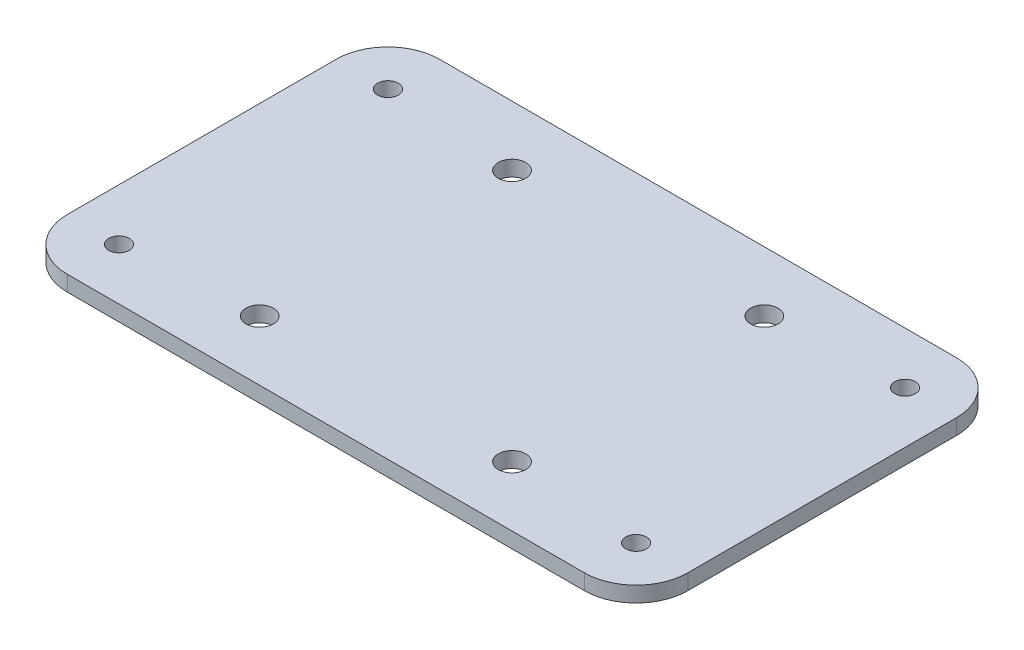
ISO-10303-21;
HEADER;
FILE_DESCRIPTION(('STEP AP214'),'2;1');
FILE_NAME('part.step','',(''),(''),'','','');
FILE_SCHEMA(('AUTOMOTIVE_DESIGN { 1 0 10303 214 1 1 1 1 }'));
ENDSEC;
DATA;
#1=APPLICATION_CONTEXT('core data for automotive mechanical design processes');
#2=APPLICATION_PROTOCOL_DEFINITION('international standard','automotive_design',2000,#1);
#3=PRODUCT_CONTEXT('',#1,'mechanical');
#4=PRODUCT('Part','Part','',(#3));
#5=PRODUCT_RELATED_PRODUCT_CATEGORY('part','',(#4));
#6=PRODUCT_DEFINITION_FORMATION('','',#4);
#7=PRODUCT_DEFINITION_CONTEXT('part definition',#1,'design');
#8=PRODUCT_DEFINITION('design','',#6,#7);
#9=PRODUCT_DEFINITION_SHAPE('','',#8);
#10=(LENGTH_UNIT() NAMED_UNIT(*) SI_UNIT(.MILLI.,.METRE.));
#11=(NAMED_UNIT(*) PLANE_ANGLE_UNIT() SI_UNIT($,.RADIAN.));
#12=(NAMED_UNIT(*) SI_UNIT($,.STERADIAN.) SOLID_ANGLE_UNIT());
#13=UNCERTAINTY_MEASURE_WITH_UNIT(LENGTH_MEASURE(1.E-05),#10,'distance_accuracy_value','');
#14=(GEOMETRIC_REPRESENTATION_CONTEXT(3) GLOBAL_UNCERTAINTY_ASSIGNED_CONTEXT((#13)) GLOBAL_UNIT_ASSIGNED_CONTEXT((#10,
#11,#12)) REPRESENTATION_CONTEXT('',''));
#15=CARTESIAN_POINT('',(0.,0.,0.));
#16=DIRECTION('',(0.,0.,1.));
#17=DIRECTION('',(1.,0.,0.));
#18=AXIS2_PLACEMENT_3D('',#15,#16,#17);
#19=CARTESIAN_POINT('',(0.,3.,0.));
#20=DIRECTION('',(0.,-1.,0.));
#21=DIRECTION('',(0.,0.,-1.));
#22=AXIS2_PLACEMENT_3D('',#19,#20,#21);
#23=PLANE('',#22);
#24=DIRECTION('',(0.,0.,1.));
#25=VECTOR('',#24,1.);
#26=CARTESIAN_POINT('',(-60.,3.,36.));
#27=LINE('',#26,#25);
#28=CARTESIAN_POINT('',(-60.,3.,-26.));
#29=VERTEX_POINT('',#28);
#30=CARTESIAN_POINT('',(-60.,3.,26.));
#31=VERTEX_POINT('',#30);
#32=EDGE_CURVE('E180',#29,#31,#27,.T.);
#33=ORIENTED_EDGE('',*,*,#32,.T.);
#34=CARTESIAN_POINT('',(-50.,3.,26.));
#35=DIRECTION('',(0.,-1.,0.));
#36=DIRECTION('',(0.,0.,-1.));
#37=AXIS2_PLACEMENT_3D('',#34,#35,#36);
#38=CIRCLE('',#37,10.);
#39=CARTESIAN_POINT('',(-50.,3.,36.));
#40=VERTEX_POINT('',#39);
#41=EDGE_CURVE('E168',#31,#40,#38,.F.);
#42=ORIENTED_EDGE('',*,*,#41,.T.);
#43=DIRECTION('',(1.,0.,0.));
#44=VECTOR('',#43,1.);
#45=CARTESIAN_POINT('',(-60.,3.,36.));
#46=LINE('',#45,#44);
#47=CARTESIAN_POINT('',(50.,3.,36.));
#48=VERTEX_POINT('',#47);
#49=EDGE_CURVE('E126',#40,#48,#46,.T.);
#50=ORIENTED_EDGE('',*,*,#49,.T.);
#51=CARTESIAN_POINT('',(50.,3.,26.));
#52=DIRECTION('',(0.,-1.,0.));
#53=DIRECTION('',(0.,0.,-1.));
#54=AXIS2_PLACEMENT_3D('',#51,#52,#53);
#55=CIRCLE('',#54,10.);
#56=CARTESIAN_POINT('',(60.,3.,26.));
#57=VERTEX_POINT('',#56);
#58=EDGE_CURVE('E165',#48,#57,#55,.F.);
#59=ORIENTED_EDGE('',*,*,#58,.T.);
#60=DIRECTION('',(0.,0.,-1.));
#61=VECTOR('',#60,1.);
#62=CARTESIAN_POINT('',(60.,3.,36.));
#63=LINE('',#62,#61);
#64=CARTESIAN_POINT('',(60.,3.,-26.));
#65=VERTEX_POINT('',#64);
#66=EDGE_CURVE('E135',#57,#65,#63,.T.);
#67=ORIENTED_EDGE('',*,*,#66,.T.);
#68=CARTESIAN_POINT('',(50.,3.,-26.));
#69=DIRECTION('',(0.,-1.,0.));
#70=DIRECTION('',(0.,0.,-1.));
#71=AXIS2_PLACEMENT_3D('',#68,#69,#70);
#72=CIRCLE('',#71,10.);
#73=CARTESIAN_POINT('',(50.,3.,-36.));
#74=VERTEX_POINT('',#73);
#75=EDGE_CURVE('E60',#65,#74,#72,.F.);
#76=ORIENTED_EDGE('',*,*,#75,.T.);
#77=DIRECTION('',(-1.,0.,0.));
#78=VECTOR('',#77,1.);
#79=CARTESIAN_POINT('',(-60.,3.,-36.));
#80=LINE('',#79,#78);
#81=CARTESIAN_POINT('',(-50.,3.,-36.));
#82=VERTEX_POINT('',#81);
#83=EDGE_CURVE('E140',#74,#82,#80,.T.);
#84=ORIENTED_EDGE('',*,*,#83,.T.);
#85=CARTESIAN_POINT('',(-50.,3.,-26.));
#86=DIRECTION('',(0.,-1.,0.));
#87=DIRECTION('',(0.,0.,-1.));
#88=AXIS2_PLACEMENT_3D('',#85,#86,#87);
#89=CIRCLE('',#88,10.);
#90=EDGE_CURVE('E160',#82,#29,#89,.F.);
#91=ORIENTED_EDGE('',*,*,#90,.T.);
#92=EDGE_LOOP('',(#33,#42,#50,#59,#67,#76,#84,#91));
#93=FACE_BOUND('',#92,.T.);
#94=CARTESIAN_POINT('',(-24.3951839509359,3.,-24.3951839509359));
#95=DIRECTION('',(0.,1.,0.));
#96=DIRECTION('',(0.,0.,1.));
#97=AXIS2_PLACEMENT_3D('',#94,#95,#96);
#98=CIRCLE('',#97,2.65);
#99=CARTESIAN_POINT('',(-24.3951839509359,3.,-21.7451839509359));
#100=VERTEX_POINT('',#99);
#101=EDGE_CURVE('E192',#100,#100,#98,.T.);
#102=ORIENTED_EDGE('',*,*,#101,.F.);
#103=EDGE_LOOP('',(#102));
#104=FACE_BOUND('',#103,.T.);
#105=CARTESIAN_POINT('',(-50.,3.,-26.));
#106=DIRECTION('',(0.,1.,0.));
#107=DIRECTION('',(0.,0.,1.));
#108=AXIS2_PLACEMENT_3D('',#105,#106,#107);
#109=CIRCLE('',#108,2.);
#110=CARTESIAN_POINT('',(-50.,3.,-24.));
#111=VERTEX_POINT('',#110);
#112=EDGE_CURVE('E310',#111,#111,#109,.T.);
#113=ORIENTED_EDGE('',*,*,#112,.F.);
#114=EDGE_LOOP('',(#113));
#115=FACE_BOUND('',#114,.T.);
#116=CARTESIAN_POINT('',(24.3951839509359,3.,-24.3951839509372));
#117=DIRECTION('',(0.,1.,0.));
#118=DIRECTION('',(0.,0.,1.));
#119=AXIS2_PLACEMENT_3D('',#116,#117,#118);
#120=CIRCLE('',#119,2.65);
#121=CARTESIAN_POINT('',(24.3951839509359,3.,-21.7451839509372));
#122=VERTEX_POINT('',#121);
#123=EDGE_CURVE('E302',#122,#122,#120,.T.);
#124=ORIENTED_EDGE('',*,*,#123,.F.);
#125=EDGE_LOOP('',(#124));
#126=FACE_BOUND('',#125,.T.);
#127=CARTESIAN_POINT('',(24.3951839509372,3.,24.3951839509346));
#128=DIRECTION('',(0.,1.,0.));
#129=DIRECTION('',(0.,0.,1.));
#130=AXIS2_PLACEMENT_3D('',#127,#128,#129);
#131=CIRCLE('',#130,2.65);
#132=CARTESIAN_POINT('',(24.3951839509372,3.,27.0451839509346));
#133=VERTEX_POINT('',#132);
#134=EDGE_CURVE('E294',#133,#133,#131,.T.);
#135=ORIENTED_EDGE('',*,*,#134,.F.);
#136=EDGE_LOOP('',(#135));
#137=FACE_BOUND('',#136,.T.);
#138=CARTESIAN_POINT('',(-24.3951839509346,3.,24.3951839509359));
#139=DIRECTION('',(0.,1.,0.));
#140=DIRECTION('',(0.,0.,1.));
#141=AXIS2_PLACEMENT_3D('',#138,#139,#140);
#142=CIRCLE('',#141,2.65);
#143=CARTESIAN_POINT('',(-24.3951839509346,3.,27.0451839509359));
#144=VERTEX_POINT('',#143);
#145=EDGE_CURVE('E286',#144,#144,#142,.T.);
#146=ORIENTED_EDGE('',*,*,#145,.F.);
#147=EDGE_LOOP('',(#146));
#148=FACE_BOUND('',#147,.T.);
#149=CARTESIAN_POINT('',(-50.,3.,26.));
#150=DIRECTION('',(0.,1.,0.));
#151=DIRECTION('',(0.,0.,1.));
#152=AXIS2_PLACEMENT_3D('',#149,#150,#151);
#153=CIRCLE('',#152,2.);
#154=CARTESIAN_POINT('',(-50.,3.,28.));
#155=VERTEX_POINT('',#154);
#156=EDGE_CURVE('E278',#155,#155,#153,.T.);
#157=ORIENTED_EDGE('',*,*,#156,.F.);
#158=EDGE_LOOP('',(#157));
#159=FACE_BOUND('',#158,.T.);
#160=CARTESIAN_POINT('',(50.0000000000002,3.,25.9999999999995));
#161=DIRECTION('',(0.,1.,0.));
#162=DIRECTION('',(0.,0.,-1.));
#163=AXIS2_PLACEMENT_3D('',#160,#161,#162);
#164=CIRCLE('',#163,1.99999999999995);
#165=CARTESIAN_POINT('',(50.0000000000002,3.,23.9999999999996));
#166=VERTEX_POINT('',#165);
#167=EDGE_CURVE('E270',#166,#166,#164,.T.);
#168=ORIENTED_EDGE('',*,*,#167,.F.);
#169=EDGE_LOOP('',(#168));
#170=FACE_BOUND('',#169,.T.);
#171=CARTESIAN_POINT('',(49.9999999999998,3.,-26.0000000000005));
#172=DIRECTION('',(0.,1.,0.));
#173=DIRECTION('',(0.,0.,-1.));
#174=AXIS2_PLACEMENT_3D('',#171,#172,#173);
#175=CIRCLE('',#174,2.);
#176=CARTESIAN_POINT('',(49.9999999999998,3.,-28.0000000000005));
#177=VERTEX_POINT('',#176);
#178=EDGE_CURVE('E259',#177,#177,#175,.T.);
#179=ORIENTED_EDGE('',*,*,#178,.F.);
#180=EDGE_LOOP('',(#179));
#181=FACE_BOUND('',#180,.T.);
#182=ADVANCED_FACE('F38',(#93,#104,#115,#126,#137,#148,#159,#170,#181),#23,.F.);
#183=CARTESIAN_POINT('',(0.,0.,0.));
#184=DIRECTION('',(0.,-1.,0.));
#185=DIRECTION('',(0.,0.,-1.));
#186=AXIS2_PLACEMENT_3D('',#183,#184,#185);
#187=PLANE('',#186);
#188=CARTESIAN_POINT('',(50.0000000000002,0.,25.9999999999995));
#189=DIRECTION('',(0.,1.,0.));
#190=DIRECTION('',(0.,0.,-1.));
#191=AXIS2_PLACEMENT_3D('',#188,#189,#190);
#192=CIRCLE('',#191,1.99999999999995);
#193=CARTESIAN_POINT('',(50.0000000000002,0.,23.9999999999996));
#194=VERTEX_POINT('',#193);
#195=EDGE_CURVE('E267',#194,#194,#192,.T.);
#196=ORIENTED_EDGE('',*,*,#195,.T.);
#197=EDGE_LOOP('',(#196));
#198=FACE_BOUND('',#197,.T.);
#199=CARTESIAN_POINT('',(-24.3951839509346,0.,24.3951839509359));
#200=DIRECTION('',(0.,1.,0.));
#201=DIRECTION('',(0.,0.,1.));
#202=AXIS2_PLACEMENT_3D('',#199,#200,#201);
#203=CIRCLE('',#202,2.65);
#204=CARTESIAN_POINT('',(-24.3951839509346,0.,27.0451839509359));
#205=VERTEX_POINT('',#204);
#206=EDGE_CURVE('E282',#205,#205,#203,.T.);
#207=ORIENTED_EDGE('',*,*,#206,.T.);
#208=EDGE_LOOP('',(#207));
#209=FACE_BOUND('',#208,.T.);
#210=CARTESIAN_POINT('',(24.3951839509359,0.,-24.3951839509372));
#211=DIRECTION('',(0.,1.,0.));
#212=DIRECTION('',(0.,0.,1.));
#213=AXIS2_PLACEMENT_3D('',#210,#211,#212);
#214=CIRCLE('',#213,2.65);
#215=CARTESIAN_POINT('',(24.3951839509359,0.,-21.7451839509372));
#216=VERTEX_POINT('',#215);
#217=EDGE_CURVE('E298',#216,#216,#214,.T.);
#218=ORIENTED_EDGE('',*,*,#217,.T.);
#219=EDGE_LOOP('',(#218));
#220=FACE_BOUND('',#219,.T.);
#221=CARTESIAN_POINT('',(-24.3951839509359,0.,-24.3951839509359));
#222=DIRECTION('',(0.,1.,0.));
#223=DIRECTION('',(0.,0.,1.));
#224=AXIS2_PLACEMENT_3D('',#221,#222,#223);
#225=CIRCLE('',#224,2.65);
#226=CARTESIAN_POINT('',(-24.3951839509359,0.,-21.7451839509359));
#227=VERTEX_POINT('',#226);
#228=EDGE_CURVE('E314',#227,#227,#225,.T.);
#229=ORIENTED_EDGE('',*,*,#228,.T.);
#230=EDGE_LOOP('',(#229));
#231=FACE_BOUND('',#230,.T.);
#232=DIRECTION('',(1.,0.,0.));
#233=VECTOR('',#232,1.);
#234=CARTESIAN_POINT('',(-60.,0.,36.));
#235=LINE('',#234,#233);
#236=CARTESIAN_POINT('',(-50.,0.,36.));
#237=VERTEX_POINT('',#236);
#238=CARTESIAN_POINT('',(50.,0.,36.));
#239=VERTEX_POINT('',#238);
#240=EDGE_CURVE('E123',#237,#239,#235,.T.);
#241=ORIENTED_EDGE('',*,*,#240,.F.);
#242=CARTESIAN_POINT('',(-50.,0.,26.));
#243=DIRECTION('',(0.,-1.,0.));
#244=DIRECTION('',(0.,0.,-1.));
#245=AXIS2_PLACEMENT_3D('',#242,#243,#244);
#246=CIRCLE('',#245,10.);
#247=CARTESIAN_POINT('',(-60.,0.,26.));
#248=VERTEX_POINT('',#247);
#249=EDGE_CURVE('E105',#237,#248,#246,.T.);
#250=ORIENTED_EDGE('',*,*,#249,.T.);
#251=DIRECTION('',(0.,0.,1.));
#252=VECTOR('',#251,1.);
#253=CARTESIAN_POINT('',(-60.,0.,36.));
#254=LINE('',#253,#252);
#255=CARTESIAN_POINT('',(-60.,0.,-26.));
#256=VERTEX_POINT('',#255);
#257=EDGE_CURVE('E136',#256,#248,#254,.T.);
#258=ORIENTED_EDGE('',*,*,#257,.F.);
#259=CARTESIAN_POINT('',(-50.,0.,-26.));
#260=DIRECTION('',(0.,-1.,0.));
#261=DIRECTION('',(0.,0.,-1.));
#262=AXIS2_PLACEMENT_3D('',#259,#260,#261);
#263=CIRCLE('',#262,10.);
#264=CARTESIAN_POINT('',(-50.,0.,-36.));
#265=VERTEX_POINT('',#264);
#266=EDGE_CURVE('E128',#256,#265,#263,.T.);
#267=ORIENTED_EDGE('',*,*,#266,.T.);
#268=DIRECTION('',(-1.,0.,0.));
#269=VECTOR('',#268,1.);
#270=CARTESIAN_POINT('',(-60.,0.,-36.));
#271=LINE('',#270,#269);
#272=CARTESIAN_POINT('',(50.,0.,-36.));
#273=VERTEX_POINT('',#272);
#274=EDGE_CURVE('E142',#273,#265,#271,.T.);
#275=ORIENTED_EDGE('',*,*,#274,.F.);
#276=CARTESIAN_POINT('',(50.,0.,-26.));
#277=DIRECTION('',(0.,-1.,0.));
#278=DIRECTION('',(0.,0.,-1.));
#279=AXIS2_PLACEMENT_3D('',#276,#277,#278);
#280=CIRCLE('',#279,10.);
#281=CARTESIAN_POINT('',(60.,0.,-26.));
#282=VERTEX_POINT('',#281);
#283=EDGE_CURVE('E150',#273,#282,#280,.T.);
#284=ORIENTED_EDGE('',*,*,#283,.T.);
#285=DIRECTION('',(0.,0.,-1.));
#286=VECTOR('',#285,1.);
#287=CARTESIAN_POINT('',(60.,0.,36.));
#288=LINE('',#287,#286);
#289=CARTESIAN_POINT('',(60.,0.,26.));
#290=VERTEX_POINT('',#289);
#291=EDGE_CURVE('E189',#290,#282,#288,.T.);
#292=ORIENTED_EDGE('',*,*,#291,.F.);
#293=CARTESIAN_POINT('',(50.,0.,26.));
#294=DIRECTION('',(0.,-1.,0.));
#295=DIRECTION('',(0.,0.,-1.));
#296=AXIS2_PLACEMENT_3D('',#293,#294,#295);
#297=CIRCLE('',#296,10.);
#298=EDGE_CURVE('E117',#290,#239,#297,.T.);
#299=ORIENTED_EDGE('',*,*,#298,.T.);
#300=EDGE_LOOP('',(#241,#250,#258,#267,#275,#284,#292,#299));
#301=FACE_BOUND('',#300,.T.);
#302=CARTESIAN_POINT('',(-50.,0.,-26.));
#303=DIRECTION('',(0.,1.,0.));
#304=DIRECTION('',(0.,0.,1.));
#305=AXIS2_PLACEMENT_3D('',#302,#303,#304);
#306=CIRCLE('',#305,2.);
#307=CARTESIAN_POINT('',(-50.,0.,-24.));
#308=VERTEX_POINT('',#307);
#309=EDGE_CURVE('E306',#308,#308,#306,.T.);
#310=ORIENTED_EDGE('',*,*,#309,.T.);
#311=EDGE_LOOP('',(#310));
#312=FACE_BOUND('',#311,.T.);
#313=CARTESIAN_POINT('',(24.3951839509372,0.,24.3951839509346));
#314=DIRECTION('',(0.,1.,0.));
#315=DIRECTION('',(0.,0.,1.));
#316=AXIS2_PLACEMENT_3D('',#313,#314,#315);
#317=CIRCLE('',#316,2.65);
#318=CARTESIAN_POINT('',(24.3951839509372,0.,27.0451839509346));
#319=VERTEX_POINT('',#318);
#320=EDGE_CURVE('E290',#319,#319,#317,.T.);
#321=ORIENTED_EDGE('',*,*,#320,.T.);
#322=EDGE_LOOP('',(#321));
#323=FACE_BOUND('',#322,.T.);
#324=CARTESIAN_POINT('',(-50.,0.,26.));
#325=DIRECTION('',(0.,1.,0.));
#326=DIRECTION('',(0.,0.,1.));
#327=AXIS2_PLACEMENT_3D('',#324,#325,#326);
#328=CIRCLE('',#327,2.);
#329=CARTESIAN_POINT('',(-50.,0.,28.));
#330=VERTEX_POINT('',#329);
#331=EDGE_CURVE('E274',#330,#330,#328,.T.);
#332=ORIENTED_EDGE('',*,*,#331,.T.);
#333=EDGE_LOOP('',(#332));
#334=FACE_BOUND('',#333,.T.);
#335=CARTESIAN_POINT('',(49.9999999999998,0.,-26.0000000000005));
#336=DIRECTION('',(0.,1.,0.));
#337=DIRECTION('',(0.,0.,-1.));
#338=AXIS2_PLACEMENT_3D('',#335,#336,#337);
#339=CIRCLE('',#338,2.);
#340=CARTESIAN_POINT('',(49.9999999999998,0.,-28.0000000000005));
#341=VERTEX_POINT('',#340);
#342=EDGE_CURVE('E262',#341,#341,#339,.T.);
#343=ORIENTED_EDGE('',*,*,#342,.T.);
#344=EDGE_LOOP('',(#343));
#345=FACE_BOUND('',#344,.T.);
#346=ADVANCED_FACE('F131',(#198,#209,#220,#231,#301,#312,#323,#334,#345),#187,.T.);
#347=CARTESIAN_POINT('',(60.,3.,36.));
#348=DIRECTION('',(-1.,0.,0.));
#349=DIRECTION('',(0.,0.,1.));
#350=AXIS2_PLACEMENT_3D('',#347,#348,#349);
#351=PLANE('',#350);
#352=ORIENTED_EDGE('',*,*,#66,.F.);
#353=DIRECTION('',(0.,-1.,0.));
#354=VECTOR('',#353,1.);
#355=CARTESIAN_POINT('',(60.,3.,26.));
#356=LINE('',#355,#354);
#357=EDGE_CURVE('E174',#57,#290,#356,.T.);
#358=ORIENTED_EDGE('',*,*,#357,.T.);
#359=ORIENTED_EDGE('',*,*,#291,.T.);
#360=DIRECTION('',(0.,-1.,0.));
#361=VECTOR('',#360,1.);
#362=CARTESIAN_POINT('',(60.,3.,-26.));
#363=LINE('',#362,#361);
#364=EDGE_CURVE('E171',#282,#65,#363,.F.);
#365=ORIENTED_EDGE('',*,*,#364,.T.);
#366=EDGE_LOOP('',(#352,#358,#359,#365));
#367=FACE_BOUND('',#366,.T.);
#368=ADVANCED_FACE('F211',(#367),#351,.F.);
#369=CARTESIAN_POINT('',(-60.,3.,-36.));
#370=DIRECTION('',(0.,0.,1.));
#371=DIRECTION('',(1.,0.,0.));
#372=AXIS2_PLACEMENT_3D('',#369,#370,#371);
#373=PLANE('',#372);
#374=ORIENTED_EDGE('',*,*,#83,.F.);
#375=DIRECTION('',(0.,-1.,0.));
#376=VECTOR('',#375,1.);
#377=CARTESIAN_POINT('',(50.,3.,-36.));
#378=LINE('',#377,#376);
#379=EDGE_CURVE('E11',#74,#273,#378,.T.);
#380=ORIENTED_EDGE('',*,*,#379,.T.);
#381=ORIENTED_EDGE('',*,*,#274,.T.);
#382=DIRECTION('',(0.,-1.,0.));
#383=VECTOR('',#382,1.);
#384=CARTESIAN_POINT('',(-50.,3.,-36.));
#385=LINE('',#384,#383);
#386=EDGE_CURVE('E47',#265,#82,#385,.F.);
#387=ORIENTED_EDGE('',*,*,#386,.T.);
#388=EDGE_LOOP('',(#374,#380,#381,#387));
#389=FACE_BOUND('',#388,.T.);
#390=ADVANCED_FACE('F195',(#389),#373,.F.);
#391=CARTESIAN_POINT('',(-60.,3.,36.));
#392=DIRECTION('',(1.,0.,0.));
#393=DIRECTION('',(0.,0.,-1.));
#394=AXIS2_PLACEMENT_3D('',#391,#392,#393);
#395=PLANE('',#394);
#396=ORIENTED_EDGE('',*,*,#257,.T.);
#397=DIRECTION('',(0.,-1.,0.));
#398=VECTOR('',#397,1.);
#399=CARTESIAN_POINT('',(-60.,3.,26.));
#400=LINE('',#399,#398);
#401=EDGE_CURVE('E110',#248,#31,#400,.F.);
#402=ORIENTED_EDGE('',*,*,#401,.T.);
#403=ORIENTED_EDGE('',*,*,#32,.F.);
#404=DIRECTION('',(0.,-1.,0.));
#405=VECTOR('',#404,1.);
#406=CARTESIAN_POINT('',(-60.,3.,-26.));
#407=LINE('',#406,#405);
#408=EDGE_CURVE('E116',#29,#256,#407,.T.);
#409=ORIENTED_EDGE('',*,*,#408,.T.);
#410=EDGE_LOOP('',(#396,#402,#403,#409));
#411=FACE_BOUND('',#410,.T.);
#412=ADVANCED_FACE('F202',(#411),#395,.F.);
#413=CARTESIAN_POINT('',(-60.,3.,36.));
#414=DIRECTION('',(0.,0.,-1.));
#415=DIRECTION('',(-1.,0.,0.));
#416=AXIS2_PLACEMENT_3D('',#413,#414,#415);
#417=PLANE('',#416);
#418=ORIENTED_EDGE('',*,*,#49,.F.);
#419=DIRECTION('',(0.,-1.,0.));
#420=VECTOR('',#419,1.);
#421=CARTESIAN_POINT('',(-50.,3.,36.));
#422=LINE('',#421,#420);
#423=EDGE_CURVE('E109',#40,#237,#422,.T.);
#424=ORIENTED_EDGE('',*,*,#423,.T.);
#425=ORIENTED_EDGE('',*,*,#240,.T.);
#426=DIRECTION('',(0.,-1.,0.));
#427=VECTOR('',#426,1.);
#428=CARTESIAN_POINT('',(50.,3.,36.));
#429=LINE('',#428,#427);
#430=EDGE_CURVE('E129',#239,#48,#429,.F.);
#431=ORIENTED_EDGE('',*,*,#430,.T.);
#432=EDGE_LOOP('',(#418,#424,#425,#431));
#433=FACE_BOUND('',#432,.T.);
#434=ADVANCED_FACE('F122',(#433),#417,.F.);
#435=CARTESIAN_POINT('',(-24.3951839509359,3.,-24.3951839509359));
#436=DIRECTION('',(0.,-1.,0.));
#437=DIRECTION('',(0.,0.,-1.));
#438=AXIS2_PLACEMENT_3D('',#435,#436,#437);
#439=CYLINDRICAL_SURFACE('',#438,2.65);
#440=ORIENTED_EDGE('',*,*,#101,.T.);
#441=EDGE_LOOP('',(#440));
#442=FACE_BOUND('',#441,.T.);
#443=ORIENTED_EDGE('',*,*,#228,.F.);
#444=EDGE_LOOP('',(#443));
#445=FACE_BOUND('',#444,.T.);
#446=ADVANCED_FACE('F209',(#442,#445),#439,.F.);
#447=CARTESIAN_POINT('',(-50.,3.,-26.));
#448=DIRECTION('',(0.,-1.,0.));
#449=DIRECTION('',(0.,0.,-1.));
#450=AXIS2_PLACEMENT_3D('',#447,#448,#449);
#451=CYLINDRICAL_SURFACE('',#450,2.);
#452=ORIENTED_EDGE('',*,*,#112,.T.);
#453=EDGE_LOOP('',(#452));
#454=FACE_BOUND('',#453,.T.);
#455=ORIENTED_EDGE('',*,*,#309,.F.);
#456=EDGE_LOOP('',(#455));
#457=FACE_BOUND('',#456,.T.);
#458=ADVANCED_FACE('F224',(#454,#457),#451,.F.);
#459=CARTESIAN_POINT('',(24.3951839509359,3.,-24.3951839509372));
#460=DIRECTION('',(0.,-1.,0.));
#461=DIRECTION('',(0.,0.,-1.));
#462=AXIS2_PLACEMENT_3D('',#459,#460,#461);
#463=CYLINDRICAL_SURFACE('',#462,2.65);
#464=ORIENTED_EDGE('',*,*,#123,.T.);
#465=EDGE_LOOP('',(#464));
#466=FACE_BOUND('',#465,.T.);
#467=ORIENTED_EDGE('',*,*,#217,.F.);
#468=EDGE_LOOP('',(#467));
#469=FACE_BOUND('',#468,.T.);
#470=ADVANCED_FACE('F228',(#466,#469),#463,.F.);
#471=CARTESIAN_POINT('',(24.3951839509372,3.,24.3951839509346));
#472=DIRECTION('',(0.,-1.,0.));
#473=DIRECTION('',(0.,0.,-1.));
#474=AXIS2_PLACEMENT_3D('',#471,#472,#473);
#475=CYLINDRICAL_SURFACE('',#474,2.65);
#476=ORIENTED_EDGE('',*,*,#134,.T.);
#477=EDGE_LOOP('',(#476));
#478=FACE_BOUND('',#477,.T.);
#479=ORIENTED_EDGE('',*,*,#320,.F.);
#480=EDGE_LOOP('',(#479));
#481=FACE_BOUND('',#480,.T.);
#482=ADVANCED_FACE('F232',(#478,#481),#475,.F.);
#483=CARTESIAN_POINT('',(-24.3951839509346,3.,24.3951839509359));
#484=DIRECTION('',(0.,-1.,0.));
#485=DIRECTION('',(0.,0.,-1.));
#486=AXIS2_PLACEMENT_3D('',#483,#484,#485);
#487=CYLINDRICAL_SURFACE('',#486,2.65);
#488=ORIENTED_EDGE('',*,*,#145,.T.);
#489=EDGE_LOOP('',(#488));
#490=FACE_BOUND('',#489,.T.);
#491=ORIENTED_EDGE('',*,*,#206,.F.);
#492=EDGE_LOOP('',(#491));
#493=FACE_BOUND('',#492,.T.);
#494=ADVANCED_FACE('F236',(#490,#493),#487,.F.);
#495=CARTESIAN_POINT('',(-50.,3.,26.));
#496=DIRECTION('',(0.,-1.,0.));
#497=DIRECTION('',(0.,0.,-1.));
#498=AXIS2_PLACEMENT_3D('',#495,#496,#497);
#499=CYLINDRICAL_SURFACE('',#498,2.);
#500=ORIENTED_EDGE('',*,*,#156,.T.);
#501=EDGE_LOOP('',(#500));
#502=FACE_BOUND('',#501,.T.);
#503=ORIENTED_EDGE('',*,*,#331,.F.);
#504=EDGE_LOOP('',(#503));
#505=FACE_BOUND('',#504,.T.);
#506=ADVANCED_FACE('F240',(#502,#505),#499,.F.);
#507=CARTESIAN_POINT('',(50.0000000000002,3.,25.9999999999995));
#508=DIRECTION('',(0.,-1.,0.));
#509=DIRECTION('',(0.,0.,-1.));
#510=AXIS2_PLACEMENT_3D('',#507,#508,#509);
#511=CYLINDRICAL_SURFACE('',#510,1.99999999999995);
#512=ORIENTED_EDGE('',*,*,#167,.T.);
#513=EDGE_LOOP('',(#512));
#514=FACE_BOUND('',#513,.T.);
#515=ORIENTED_EDGE('',*,*,#195,.F.);
#516=EDGE_LOOP('',(#515));
#517=FACE_BOUND('',#516,.T.);
#518=ADVANCED_FACE('F244',(#514,#517),#511,.F.);
#519=CARTESIAN_POINT('',(49.9999999999998,3.,-26.0000000000005));
#520=DIRECTION('',(0.,-1.,0.));
#521=DIRECTION('',(0.,0.,-1.));
#522=AXIS2_PLACEMENT_3D('',#519,#520,#521);
#523=CYLINDRICAL_SURFACE('',#522,2.);
#524=ORIENTED_EDGE('',*,*,#178,.T.);
#525=EDGE_LOOP('',(#524));
#526=FACE_BOUND('',#525,.T.);
#527=ORIENTED_EDGE('',*,*,#342,.F.);
#528=EDGE_LOOP('',(#527));
#529=FACE_BOUND('',#528,.T.);
#530=ADVANCED_FACE('F248',(#526,#529),#523,.F.);
#531=CARTESIAN_POINT('',(-50.,3.,26.));
#532=DIRECTION('',(0.,-1.,0.));
#533=DIRECTION('',(0.,0.,-1.));
#534=AXIS2_PLACEMENT_3D('',#531,#532,#533);
#535=CYLINDRICAL_SURFACE('',#534,10.);
#536=ORIENTED_EDGE('',*,*,#41,.F.);
#537=ORIENTED_EDGE('',*,*,#401,.F.);
#538=ORIENTED_EDGE('',*,*,#249,.F.);
#539=ORIENTED_EDGE('',*,*,#423,.F.);
#540=EDGE_LOOP('',(#536,#537,#538,#539));
#541=FACE_BOUND('',#540,.T.);
#542=ADVANCED_FACE('F108',(#541),#535,.T.);
#543=CARTESIAN_POINT('',(50.,3.,26.));
#544=DIRECTION('',(0.,-1.,0.));
#545=DIRECTION('',(0.,0.,-1.));
#546=AXIS2_PLACEMENT_3D('',#543,#544,#545);
#547=CYLINDRICAL_SURFACE('',#546,10.);
#548=ORIENTED_EDGE('',*,*,#58,.F.);
#549=ORIENTED_EDGE('',*,*,#430,.F.);
#550=ORIENTED_EDGE('',*,*,#298,.F.);
#551=ORIENTED_EDGE('',*,*,#357,.F.);
#552=EDGE_LOOP('',(#548,#549,#550,#551));
#553=FACE_BOUND('',#552,.T.);
#554=ADVANCED_FACE('F254',(#553),#547,.T.);
#555=CARTESIAN_POINT('',(50.,3.,-26.));
#556=DIRECTION('',(0.,-1.,0.));
#557=DIRECTION('',(0.,0.,-1.));
#558=AXIS2_PLACEMENT_3D('',#555,#556,#557);
#559=CYLINDRICAL_SURFACE('',#558,10.);
#560=ORIENTED_EDGE('',*,*,#75,.F.);
#561=ORIENTED_EDGE('',*,*,#364,.F.);
#562=ORIENTED_EDGE('',*,*,#283,.F.);
#563=ORIENTED_EDGE('',*,*,#379,.F.);
#564=EDGE_LOOP('',(#560,#561,#562,#563));
#565=FACE_BOUND('',#564,.T.);
#566=ADVANCED_FACE('F358',(#565),#559,.T.);
#567=CARTESIAN_POINT('',(-50.,3.,-26.));
#568=DIRECTION('',(0.,-1.,0.));
#569=DIRECTION('',(0.,0.,-1.));
#570=AXIS2_PLACEMENT_3D('',#567,#568,#569);
#571=CYLINDRICAL_SURFACE('',#570,10.);
#572=ORIENTED_EDGE('',*,*,#90,.F.);
#573=ORIENTED_EDGE('',*,*,#386,.F.);
#574=ORIENTED_EDGE('',*,*,#266,.F.);
#575=ORIENTED_EDGE('',*,*,#408,.F.);
#576=EDGE_LOOP('',(#572,#573,#574,#575));
#577=FACE_BOUND('',#576,.T.);
#578=ADVANCED_FACE('F40',(#577),#571,.T.);
#579=CLOSED_SHELL('',(#182,#346,#368,#390,#412,#434,#446,#458,#470,#482,#494,#506,#518,#530,
#542,#554,#566,#578));
#580=MANIFOLD_SOLID_BREP('B2',#579);
#581=ADVANCED_BREP_SHAPE_REPRESENTATION('',(#18,#580),#14);
#582=SHAPE_DEFINITION_REPRESENTATION(#9,#581);
ENDSEC;
END-ISO-10303-21;
